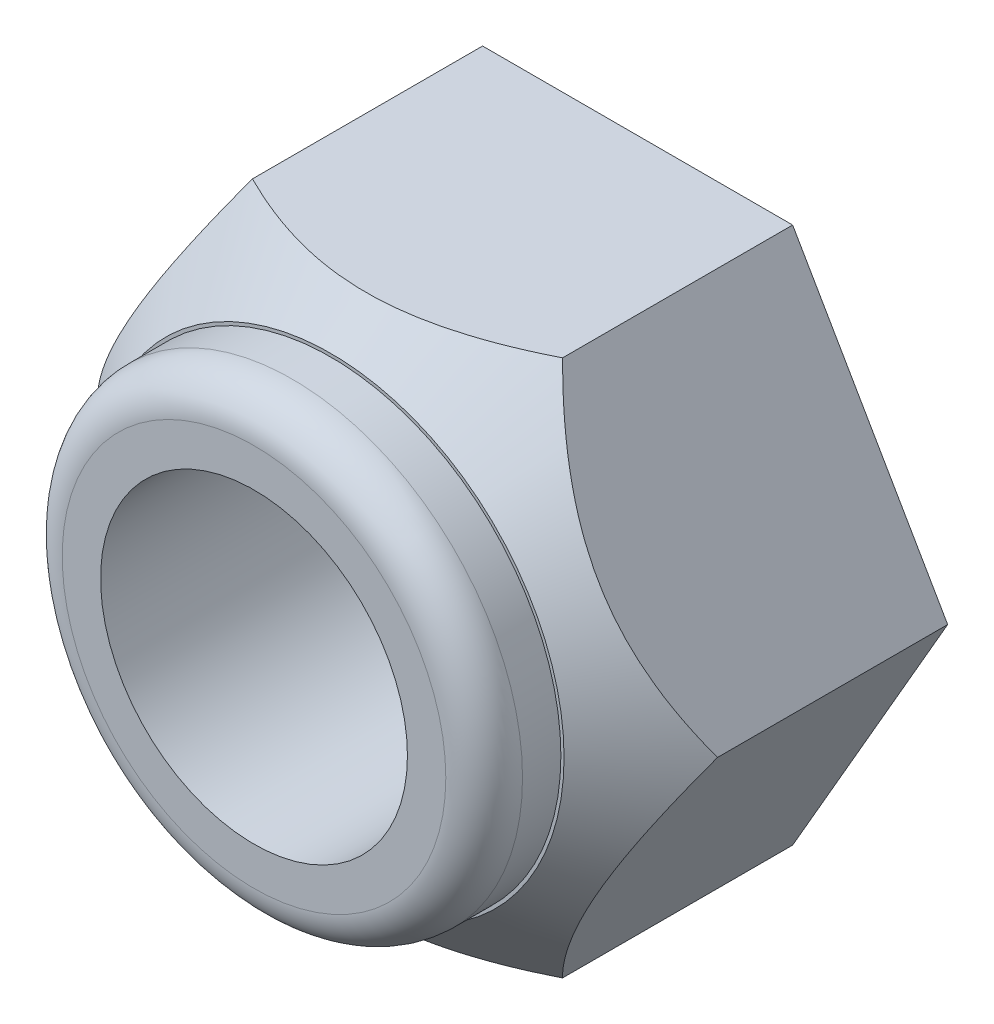
ISO-10303-21;
HEADER;
FILE_DESCRIPTION(('STEP AP214'),'2;1');
FILE_NAME('part.step','',(''),(''),'','','');
FILE_SCHEMA(('AUTOMOTIVE_DESIGN { 1 0 10303 214 1 1 1 1 }'));
ENDSEC;
DATA;
#1=APPLICATION_CONTEXT('core data for automotive mechanical design processes');
#2=APPLICATION_PROTOCOL_DEFINITION('international standard','automotive_design',2000,#1);
#3=PRODUCT_CONTEXT('',#1,'mechanical');
#4=PRODUCT('Part','Part','',(#3));
#5=PRODUCT_RELATED_PRODUCT_CATEGORY('part','',(#4));
#6=PRODUCT_DEFINITION_FORMATION('','',#4);
#7=PRODUCT_DEFINITION_CONTEXT('part definition',#1,'design');
#8=PRODUCT_DEFINITION('design','',#6,#7);
#9=PRODUCT_DEFINITION_SHAPE('','',#8);
#10=(LENGTH_UNIT() NAMED_UNIT(*) SI_UNIT(.MILLI.,.METRE.));
#11=(NAMED_UNIT(*) PLANE_ANGLE_UNIT() SI_UNIT($,.RADIAN.));
#12=(NAMED_UNIT(*) SI_UNIT($,.STERADIAN.) SOLID_ANGLE_UNIT());
#13=UNCERTAINTY_MEASURE_WITH_UNIT(LENGTH_MEASURE(1.E-05),#10,'distance_accuracy_value','');
#14=(GEOMETRIC_REPRESENTATION_CONTEXT(3) GLOBAL_UNCERTAINTY_ASSIGNED_CONTEXT((#13)) GLOBAL_UNIT_ASSIGNED_CONTEXT((#10,
#11,#12)) REPRESENTATION_CONTEXT('',''));
#15=CARTESIAN_POINT('',(0.,0.,0.));
#16=DIRECTION('',(0.,0.,1.));
#17=DIRECTION('',(1.,0.,0.));
#18=AXIS2_PLACEMENT_3D('',#15,#16,#17);
#19=CARTESIAN_POINT('',(2.02072594216369,-3.5,4.));
#20=DIRECTION('',(-0.866025403784439,0.5,0.));
#21=DIRECTION('',(-0.5,-0.866025403784439,0.));
#22=AXIS2_PLACEMENT_3D('',#19,#20,#21);
#23=PLANE('',#22);
#24=CARTESIAN_POINT('',(2.02061047210985,-3.5002,2.99988452499759));
#25=CARTESIAN_POINT('',(2.09007076582137,-3.37989124218299,3.06928406626867));
#26=CARTESIAN_POINT('',(2.16069251433702,-3.25757078563454,3.13460752114447));
#27=CARTESIAN_POINT('',(2.30469791501954,-3.0081461150881,3.25421294831347));
#28=CARTESIAN_POINT('',(2.37809526074122,-2.88101818315745,3.30842837712061));
#29=CARTESIAN_POINT('',(2.52609746963703,-2.62467083771748,3.40130032476617));
#30=CARTESIAN_POINT('',(2.60066464532078,-2.49551670085632,3.44019025979248));
#31=CARTESIAN_POINT('',(2.75144053111007,-2.23436520611305,3.50010809560692));
#32=CARTESIAN_POINT('',(2.82764463582487,-2.10237582500173,3.52118071965238));
#33=CARTESIAN_POINT('',(2.9589800046599,-1.87489629334866,3.54019388535165));
#34=CARTESIAN_POINT('',(3.01394167249194,-1.77969989219485,3.54300830014006));
#35=CARTESIAN_POINT('',(3.1237756002776,-1.58946194887522,3.53826531256006));
#36=CARTESIAN_POINT('',(3.17864782213825,-1.49442047268838,3.53070427424299));
#37=CARTESIAN_POINT('',(3.28787240448755,-1.30523794662391,3.5056421037456));
#38=CARTESIAN_POINT('',(3.34222411425439,-1.21109802382951,3.48812985361989));
#39=CARTESIAN_POINT('',(3.4499940609728,-1.02443500058424,3.44412110260568));
#40=CARTESIAN_POINT('',(3.50341236916322,-0.931911776744044,3.41762529053566));
#41=CARTESIAN_POINT('',(3.59824414642312,-0.767658320357852,3.36311203056567));
#42=CARTESIAN_POINT('',(3.63986754439452,-0.695564480287727,3.33652769615023));
#43=CARTESIAN_POINT('',(3.72236709889695,-0.55267106028771,3.27907462503667));
#44=CARTESIAN_POINT('',(3.76324323262423,-0.481871519855086,3.24820575783653));
#45=CARTESIAN_POINT('',(3.84411947811356,-0.341789753542157,3.18287565935587));
#46=CARTESIAN_POINT('',(3.88412189017021,-0.272503543434726,3.14842572434903));
#47=CARTESIAN_POINT('',(3.96338588982946,-0.135214268813788,3.07638590028467));
#48=CARTESIAN_POINT('',(4.00264791412852,-0.067210447919811,3.03879793793945));
#49=CARTESIAN_POINT('',(4.04156735438122,0.000200000000000176,2.99988452499759));
#50=B_SPLINE_CURVE_WITH_KNOTS('',3,(#24,#25,#26,#27,#28,#29,#30,#31,#32,#33,#34,#35,#36,#37,#38,
#39,#40,#41,#42,#43,#44,#45,#46,#47,#48,#49),.UNSPECIFIED.,.F.,.F.,(4,2,2,2,2,2,2,2,2,2,2,2,4),
(0.,0.466195029511833,0.935106055247665,1.3965703522971,1.85687285909025,2.18628459516076,
2.51581179896771,2.84570789142399,3.17557869467336,3.43762138891188,3.69967206642681,
3.96091985737577,4.22200840855896),.UNSPECIFIED.);
#51=CARTESIAN_POINT('',(2.02072594216369,-3.5,3.));
#52=VERTEX_POINT('',#51);
#53=CARTESIAN_POINT('',(4.04145188432738,0.,3.));
#54=VERTEX_POINT('',#53);
#55=EDGE_CURVE('E92',#52,#54,#50,.T.);
#56=ORIENTED_EDGE('',*,*,#55,.F.);
#57=DIRECTION('',(0.,0.,-1.));
#58=VECTOR('',#57,1.);
#59=CARTESIAN_POINT('',(2.02072594216369,-3.5,4.));
#60=LINE('',#59,#58);
#61=CARTESIAN_POINT('',(2.02072594216369,-3.5,0.));
#62=VERTEX_POINT('',#61);
#63=EDGE_CURVE('E63',#52,#62,#60,.T.);
#64=ORIENTED_EDGE('',*,*,#63,.T.);
#65=DIRECTION('',(0.5,0.866025403784439,0.));
#66=VECTOR('',#65,1.);
#67=CARTESIAN_POINT('',(2.02072594216369,-3.5,0.));
#68=LINE('',#67,#66);
#69=CARTESIAN_POINT('',(4.04145188432738,0.,0.));
#70=VERTEX_POINT('',#69);
#71=EDGE_CURVE('E111',#62,#70,#68,.T.);
#72=ORIENTED_EDGE('',*,*,#71,.T.);
#73=DIRECTION('',(0.,0.,-1.));
#74=VECTOR('',#73,1.);
#75=CARTESIAN_POINT('',(4.04145188432738,0.,4.));
#76=LINE('',#75,#74);
#77=EDGE_CURVE('E105',#54,#70,#76,.T.);
#78=ORIENTED_EDGE('',*,*,#77,.F.);
#79=EDGE_LOOP('',(#56,#64,#72,#78));
#80=FACE_BOUND('',#79,.T.);
#81=ADVANCED_FACE('F40',(#80),#23,.F.);
#82=CARTESIAN_POINT('',(4.04145188432738,0.,4.));
#83=DIRECTION('',(-0.866025403784439,-0.5,0.));
#84=DIRECTION('',(0.5,-0.866025403784439,0.));
#85=AXIS2_PLACEMENT_3D('',#82,#83,#84);
#86=PLANE('',#85);
#87=CARTESIAN_POINT('',(4.04156735438122,-0.000200000000000041,2.99988452499759));
#88=CARTESIAN_POINT('',(3.9721070606697,0.120108757817009,3.06928406626868));
#89=CARTESIAN_POINT('',(3.90148531215405,0.242429214365459,3.13460752114448));
#90=CARTESIAN_POINT('',(3.75747991147153,0.491853884911905,3.25421294831347));
#91=CARTESIAN_POINT('',(3.68408256574985,0.618981816842551,3.30842837712061));
#92=CARTESIAN_POINT('',(3.53608035685404,0.875329162282522,3.40130032476617));
#93=CARTESIAN_POINT('',(3.46151318117029,1.00448329914368,3.44019025979248));
#94=CARTESIAN_POINT('',(3.310737295381,1.26563479388695,3.50010809560692));
#95=CARTESIAN_POINT('',(3.2345331906662,1.39762417499827,3.52118071965238));
#96=CARTESIAN_POINT('',(3.10319782183117,1.62510370665134,3.54019388535165));
#97=CARTESIAN_POINT('',(3.04823615399914,1.72030010780515,3.54300830014006));
#98=CARTESIAN_POINT('',(2.93840222621347,1.91053805112478,3.53826531256006));
#99=CARTESIAN_POINT('',(2.88353000435282,2.00557952731162,3.53070427424299));
#100=CARTESIAN_POINT('',(2.77430542200352,2.19476205337609,3.5056421037456));
#101=CARTESIAN_POINT('',(2.71995371223668,2.28890197617049,3.48812985361989));
#102=CARTESIAN_POINT('',(2.61218376551827,2.47556499941576,3.44412110260568));
#103=CARTESIAN_POINT('',(2.55876545732785,2.56808822325595,3.41762529053566));
#104=CARTESIAN_POINT('',(2.46393368006795,2.73234167964215,3.36311203056568));
#105=CARTESIAN_POINT('',(2.42231028209655,2.80443551971227,3.33652769615023));
#106=CARTESIAN_POINT('',(2.33981072759412,2.94732893971229,3.27907462503667));
#107=CARTESIAN_POINT('',(2.29893459386684,3.01812848014491,3.24820575783653));
#108=CARTESIAN_POINT('',(2.21805834837751,3.15821024645784,3.18287565935587));
#109=CARTESIAN_POINT('',(2.17805593632086,3.22749645656527,3.14842572434903));
#110=CARTESIAN_POINT('',(2.09879193666161,3.36478573118621,3.07638590028466));
#111=CARTESIAN_POINT('',(2.05952991236255,3.43278955208019,3.03879793793945));
#112=CARTESIAN_POINT('',(2.02061047210985,3.5002,2.99988452499759));
#113=B_SPLINE_CURVE_WITH_KNOTS('',3,(#87,#88,#89,#90,#91,#92,#93,#94,#95,#96,#97,#98,#99,#100,
#101,#102,#103,#104,#105,#106,#107,#108,#109,#110,#111,#112),.UNSPECIFIED.,.F.,.F.,(4,2,2,2,2,2,
2,2,2,2,2,2,4),(0.,0.466195029511833,0.935106055247663,1.3965703522971,1.85687285909024,
2.18628459516076,2.5158117989677,2.84570789142399,3.17557869467336,3.43762138891188,
3.69967206642681,3.96091985737577,4.22200840855896),.UNSPECIFIED.);
#114=CARTESIAN_POINT('',(2.02072594216369,3.5,3.));
#115=VERTEX_POINT('',#114);
#116=EDGE_CURVE('E95',#54,#115,#113,.T.);
#117=ORIENTED_EDGE('',*,*,#116,.F.);
#118=ORIENTED_EDGE('',*,*,#77,.T.);
#119=DIRECTION('',(-0.5,0.866025403784439,0.));
#120=VECTOR('',#119,1.);
#121=CARTESIAN_POINT('',(4.04145188432738,0.,0.));
#122=LINE('',#121,#120);
#123=CARTESIAN_POINT('',(2.02072594216369,3.5,0.));
#124=VERTEX_POINT('',#123);
#125=EDGE_CURVE('E226',#70,#124,#122,.T.);
#126=ORIENTED_EDGE('',*,*,#125,.T.);
#127=DIRECTION('',(0.,0.,-1.));
#128=VECTOR('',#127,1.);
#129=CARTESIAN_POINT('',(2.02072594216369,3.5,4.));
#130=LINE('',#129,#128);
#131=EDGE_CURVE('E107',#115,#124,#130,.T.);
#132=ORIENTED_EDGE('',*,*,#131,.F.);
#133=EDGE_LOOP('',(#117,#118,#126,#132));
#134=FACE_BOUND('',#133,.T.);
#135=ADVANCED_FACE('F103',(#134),#86,.F.);
#136=CARTESIAN_POINT('',(2.02072594216369,3.5,4.));
#137=DIRECTION('',(0.,-1.,0.));
#138=DIRECTION('',(0.,0.,-1.));
#139=AXIS2_PLACEMENT_3D('',#136,#137,#138);
#140=PLANE('',#139);
#141=CARTESIAN_POINT('',(6.18425794109595,3.5,-0.0645347665190989));
#142=CARTESIAN_POINT('',(6.00180252654366,3.5,0.0941931425634753));
#143=CARTESIAN_POINT('',(5.81855215929302,3.5,0.252024823630412));
#144=CARTESIAN_POINT('',(5.44984191649664,3.5,0.565257782151259));
#145=CARTESIAN_POINT('',(5.26438105403686,3.5,0.720657896457543));
#146=CARTESIAN_POINT('',(4.88669130230278,3.5,1.03162277509105));
#147=CARTESIAN_POINT('',(4.69440326492645,3.5,1.18711601797476));
#148=CARTESIAN_POINT('',(4.30626561764559,3.5,1.49350550896465));
#149=CARTESIAN_POINT('',(4.11041690570991,3.5,1.64440289111196));
#150=CARTESIAN_POINT('',(3.71371859725802,3.5,1.94006784433849));
#151=CARTESIAN_POINT('',(3.51286314861781,3.5,2.08482765129034));
#152=CARTESIAN_POINT('',(3.20673344587427,3.5,2.29511819124888));
#153=CARTESIAN_POINT('',(3.10383363341975,3.5,2.36410389655238));
#154=CARTESIAN_POINT('',(2.8961903592131,3.5,2.49923980051294));
#155=CARTESIAN_POINT('',(2.79144701856378,3.5,2.56539018445103));
#156=CARTESIAN_POINT('',(2.58058086876806,3.5,2.69375683068548));
#157=CARTESIAN_POINT('',(2.47447304084535,3.5,2.75599759314834));
#158=CARTESIAN_POINT('',(2.25984937299589,3.5,2.8762370471503));
#159=CARTESIAN_POINT('',(2.15133324438093,3.5,2.93423522650266));
#160=CARTESIAN_POINT('',(1.93177906137795,3.5,3.04485425015904));
#161=CARTESIAN_POINT('',(1.82074507140703,3.5,3.0974830982086));
#162=CARTESIAN_POINT('',(1.59579394236442,3.5,3.19614991961919));
#163=CARTESIAN_POINT('',(1.48187759191905,3.5,3.24218967332129));
#164=CARTESIAN_POINT('',(1.24844159989536,3.5,3.32708398721729));
#165=CARTESIAN_POINT('',(1.12885352569492,3.5,3.36575300713368));
#166=CARTESIAN_POINT('',(0.886781548075113,3.5,3.43273007467783));
#167=CARTESIAN_POINT('',(0.764298108293455,3.5,3.46103976934887));
#168=CARTESIAN_POINT('',(0.517922325796097,3.5,3.50539799895646));
#169=CARTESIAN_POINT('',(0.394044638458065,3.5,3.52152630779941));
#170=CARTESIAN_POINT('',(0.145271626545305,3.5,3.54063234159069));
#171=CARTESIAN_POINT('',(0.0203764319135412,3.5,3.54361172017292));
#172=CARTESIAN_POINT('',(-0.229279066918616,3.5,3.53617558395289));
#173=CARTESIAN_POINT('',(-0.354038478113732,3.5,3.52573074786894));
#174=CARTESIAN_POINT('',(-0.601836642194169,3.5,3.49221037144704));
#175=CARTESIAN_POINT('',(-0.724875034563236,3.5,3.46913222416696));
#176=CARTESIAN_POINT('',(-0.969203127736882,3.5,3.41169547122701));
#177=CARTESIAN_POINT('',(-1.09047314040738,3.5,3.37725462257617));
#178=CARTESIAN_POINT('',(-1.32990834418581,3.5,3.29901384215753));
#179=CARTESIAN_POINT('',(-1.44807345535859,3.5,3.25521366970014));
#180=CARTESIAN_POINT('',(-1.7049370843499,3.5,3.15038569141806));
#181=CARTESIAN_POINT('',(-1.84293869501331,3.5,3.08766555178858));
#182=CARTESIAN_POINT('',(-2.1148495863445,3.5,2.95383982666475));
#183=CARTESIAN_POINT('',(-2.24875648222451,3.5,2.88272946751852));
#184=CARTESIAN_POINT('',(-2.51322338205659,3.5,2.73397963092193));
#185=CARTESIAN_POINT('',(-2.64377599615141,3.5,2.6563271221019));
#186=CARTESIAN_POINT('',(-2.90177743652464,3.5,2.49611401182857));
#187=CARTESIAN_POINT('',(-3.02922686295059,3.5,2.41355437020094));
#188=CARTESIAN_POINT('',(-3.28223316692501,3.5,2.2441423743376));
#189=CARTESIAN_POINT('',(-3.40777598214615,3.5,2.15726911597835));
#190=CARTESIAN_POINT('',(-3.65668155685983,3.5,1.98045691058987));
#191=CARTESIAN_POINT('',(-3.78004423912119,3.5,1.8905178552841));
#192=CARTESIAN_POINT('',(-4.14712153109654,3.5,1.61726618893212));
#193=CARTESIAN_POINT('',(-4.38812382939733,3.5,1.43031481916302));
#194=CARTESIAN_POINT('',(-4.89289832862635,3.5,1.02774022303412));
#195=CARTESIAN_POINT('',(-5.15603157796543,3.5,0.811323338605823));
#196=CARTESIAN_POINT('',(-5.54580687189912,3.5,0.483926385732411));
#197=CARTESIAN_POINT('',(-5.674169349427,3.5,0.374981766231863));
#198=CARTESIAN_POINT('',(-5.92990735712964,3.5,0.155999769573668));
#199=CARTESIAN_POINT('',(-6.05728311064127,3.5,0.0459626533708356));
#200=CARTESIAN_POINT('',(-6.18425794109596,3.5,-0.0645347665191007));
#201=B_SPLINE_CURVE_WITH_KNOTS('',3,(#141,#142,#143,#144,#145,#146,#147,#148,#149,#150,#151,
#152,#153,#154,#155,#156,#157,#158,#159,#160,#161,#162,#163,#164,#165,#166,#167,#168,#169,#170,
#171,#172,#173,#174,#175,#176,#177,#178,#179,#180,#181,#182,#183,#184,#185,#186,#187,#188,#189,
#190,#191,#192,#193,#194,#195,#196,#197,#198,#199,#200),.UNSPECIFIED.,.F.,.F.,(4,2,2,2,2,2,2,2,
2,2,2,2,2,2,2,2,2,2,2,2,2,2,2,2,2,2,2,2,2,4),(0.,0.725521243102912,1.45137953906293,
2.19319911099142,2.93483412902759,3.67738092087147,4.04899899439939,4.42059274649379,
4.78956026666891,5.158572257261,5.52702588977471,5.8953797792032,6.27204413855171,
6.64864858547245,7.02276480011038,7.39683396385705,7.77172156280176,8.14668655071227,
8.52442735444327,8.9021778735366,9.35655282797108,9.81118755906022,10.2667503207701,
10.7222242666657,11.1801753204783,11.6381425648103,12.5529930135776,13.5749883379068,
14.0800703937447,14.5850345765213),.UNSPECIFIED.);
#202=CARTESIAN_POINT('',(-2.02072594216369,3.5,3.));
#203=VERTEX_POINT('',#202);
#204=EDGE_CURVE('E108',#115,#203,#201,.T.);
#205=ORIENTED_EDGE('',*,*,#204,.F.);
#206=ORIENTED_EDGE('',*,*,#131,.T.);
#207=DIRECTION('',(-1.,0.,0.));
#208=VECTOR('',#207,1.);
#209=CARTESIAN_POINT('',(2.02072594216369,3.5,0.));
#210=LINE('',#209,#208);
#211=CARTESIAN_POINT('',(-2.02072594216369,3.5,0.));
#212=VERTEX_POINT('',#211);
#213=EDGE_CURVE('E228',#124,#212,#210,.T.);
#214=ORIENTED_EDGE('',*,*,#213,.T.);
#215=DIRECTION('',(0.,0.,-1.));
#216=VECTOR('',#215,1.);
#217=CARTESIAN_POINT('',(-2.02072594216369,3.5,4.));
#218=LINE('',#217,#216);
#219=EDGE_CURVE('E116',#203,#212,#218,.T.);
#220=ORIENTED_EDGE('',*,*,#219,.F.);
#221=EDGE_LOOP('',(#205,#206,#214,#220));
#222=FACE_BOUND('',#221,.T.);
#223=ADVANCED_FACE('F143',(#222),#140,.F.);
#224=CARTESIAN_POINT('',(-2.02072594216369,3.5,4.));
#225=DIRECTION('',(0.866025403784439,-0.5,0.));
#226=DIRECTION('',(0.5,0.866025403784439,0.));
#227=AXIS2_PLACEMENT_3D('',#224,#225,#226);
#228=PLANE('',#227);
#229=CARTESIAN_POINT('',(-2.02061047210985,3.5002,2.99988452499759));
#230=CARTESIAN_POINT('',(-2.09007076582137,3.37989124218299,3.06928406626867));
#231=CARTESIAN_POINT('',(-2.16069251433702,3.25757078563454,3.13460752114447));
#232=CARTESIAN_POINT('',(-2.30469791501954,3.0081461150881,3.25421294831347));
#233=CARTESIAN_POINT('',(-2.37809526074122,2.88101818315745,3.30842837712061));
#234=CARTESIAN_POINT('',(-2.52609746963704,2.62467083771748,3.40130032476617));
#235=CARTESIAN_POINT('',(-2.60066464532078,2.49551670085632,3.44019025979248));
#236=CARTESIAN_POINT('',(-2.75144053111008,2.23436520611306,3.50010809560692));
#237=CARTESIAN_POINT('',(-2.82764463582487,2.10237582500173,3.52118071965238));
#238=CARTESIAN_POINT('',(-2.9589800046599,1.87489629334866,3.54019388535165));
#239=CARTESIAN_POINT('',(-3.01394167249194,1.77969989219485,3.54300830014005));
#240=CARTESIAN_POINT('',(-3.12377560027761,1.58946194887522,3.53826531256005));
#241=CARTESIAN_POINT('',(-3.17864782213826,1.49442047268838,3.53070427424299));
#242=CARTESIAN_POINT('',(-3.28787240448756,1.30523794662391,3.5056421037456));
#243=CARTESIAN_POINT('',(-3.34222411425439,1.21109802382951,3.48812985361989));
#244=CARTESIAN_POINT('',(-3.4499940609728,1.02443500058424,3.44412110260568));
#245=CARTESIAN_POINT('',(-3.50341236916323,0.931911776744044,3.41762529053566));
#246=CARTESIAN_POINT('',(-3.59824414642312,0.767658320357852,3.36311203056567));
#247=CARTESIAN_POINT('',(-3.63986754439452,0.695564480287727,3.33652769615023));
#248=CARTESIAN_POINT('',(-3.72236709889696,0.55267106028771,3.27907462503667));
#249=CARTESIAN_POINT('',(-3.76324323262423,0.481871519855086,3.24820575783653));
#250=CARTESIAN_POINT('',(-3.84411947811356,0.341789753542158,3.18287565935587));
#251=CARTESIAN_POINT('',(-3.88412189017022,0.272503543434726,3.14842572434903));
#252=CARTESIAN_POINT('',(-3.96338588982946,0.135214268813788,3.07638590028466));
#253=CARTESIAN_POINT('',(-4.00264791412852,0.0672104479198113,3.03879793793945));
#254=CARTESIAN_POINT('',(-4.04156735438122,-0.000200000000000049,2.99988452499759));
#255=B_SPLINE_CURVE_WITH_KNOTS('',3,(#229,#230,#231,#232,#233,#234,#235,#236,#237,#238,#239,
#240,#241,#242,#243,#244,#245,#246,#247,#248,#249,#250,#251,#252,#253,#254),.UNSPECIFIED.,.F.,
.F.,(4,2,2,2,2,2,2,2,2,2,2,2,4),(0.,0.466195029511834,0.935106055247666,1.3965703522971,
1.85687285909025,2.18628459516076,2.51581179896771,2.84570789142399,3.17557869467336,
3.43762138891188,3.69967206642681,3.96091985737577,4.22200840855896),.UNSPECIFIED.);
#256=CARTESIAN_POINT('',(-4.04145188432738,0.,3.));
#257=VERTEX_POINT('',#256);
#258=EDGE_CURVE('E180',#203,#257,#255,.T.);
#259=ORIENTED_EDGE('',*,*,#258,.F.);
#260=ORIENTED_EDGE('',*,*,#219,.T.);
#261=DIRECTION('',(-0.5,-0.866025403784439,0.));
#262=VECTOR('',#261,1.);
#263=CARTESIAN_POINT('',(-2.02072594216369,3.5,0.));
#264=LINE('',#263,#262);
#265=CARTESIAN_POINT('',(-4.04145188432738,0.,0.));
#266=VERTEX_POINT('',#265);
#267=EDGE_CURVE('E233',#212,#266,#264,.T.);
#268=ORIENTED_EDGE('',*,*,#267,.T.);
#269=DIRECTION('',(0.,0.,-1.));
#270=VECTOR('',#269,1.);
#271=CARTESIAN_POINT('',(-4.04145188432738,0.,4.));
#272=LINE('',#271,#270);
#273=EDGE_CURVE('E244',#257,#266,#272,.T.);
#274=ORIENTED_EDGE('',*,*,#273,.F.);
#275=EDGE_LOOP('',(#259,#260,#268,#274));
#276=FACE_BOUND('',#275,.T.);
#277=ADVANCED_FACE('F192',(#276),#228,.F.);
#278=CARTESIAN_POINT('',(-4.04145188432738,0.,4.));
#279=DIRECTION('',(0.866025403784439,0.5,0.));
#280=DIRECTION('',(-0.5,0.866025403784439,0.));
#281=AXIS2_PLACEMENT_3D('',#278,#279,#280);
#282=PLANE('',#281);
#283=CARTESIAN_POINT('',(-4.04156735438122,0.000200000000000097,2.99988452499759));
#284=CARTESIAN_POINT('',(-3.9721070606697,-0.120108757817009,3.06928406626867));
#285=CARTESIAN_POINT('',(-3.90148531215405,-0.242429214365458,3.13460752114447));
#286=CARTESIAN_POINT('',(-3.75747991147153,-0.491853884911905,3.25421294831347));
#287=CARTESIAN_POINT('',(-3.68408256574985,-0.618981816842551,3.30842837712061));
#288=CARTESIAN_POINT('',(-3.53608035685404,-0.875329162282523,3.40130032476617));
#289=CARTESIAN_POINT('',(-3.4615131811703,-1.00448329914368,3.44019025979248));
#290=CARTESIAN_POINT('',(-3.310737295381,-1.26563479388695,3.50010809560692));
#291=CARTESIAN_POINT('',(-3.2345331906662,-1.39762417499828,3.52118071965238));
#292=CARTESIAN_POINT('',(-3.10319782183117,-1.62510370665134,3.54019388535165));
#293=CARTESIAN_POINT('',(-3.04823615399914,-1.72030010780515,3.54300830014005));
#294=CARTESIAN_POINT('',(-2.93840222621347,-1.91053805112478,3.53826531256006));
#295=CARTESIAN_POINT('',(-2.88353000435282,-2.00557952731162,3.53070427424299));
#296=CARTESIAN_POINT('',(-2.77430542200352,-2.19476205337609,3.5056421037456));
#297=CARTESIAN_POINT('',(-2.71995371223668,-2.28890197617049,3.48812985361989));
#298=CARTESIAN_POINT('',(-2.61218376551828,-2.47556499941576,3.44412110260568));
#299=CARTESIAN_POINT('',(-2.55876545732785,-2.56808822325596,3.41762529053566));
#300=CARTESIAN_POINT('',(-2.46393368006795,-2.73234167964215,3.36311203056567));
#301=CARTESIAN_POINT('',(-2.42231028209655,-2.80443551971227,3.33652769615023));
#302=CARTESIAN_POINT('',(-2.33981072759412,-2.94732893971229,3.27907462503667));
#303=CARTESIAN_POINT('',(-2.29893459386684,-3.01812848014491,3.24820575783653));
#304=CARTESIAN_POINT('',(-2.21805834837751,-3.15821024645784,3.18287565935587));
#305=CARTESIAN_POINT('',(-2.17805593632086,-3.22749645656527,3.14842572434903));
#306=CARTESIAN_POINT('',(-2.09879193666161,-3.36478573118621,3.07638590028466));
#307=CARTESIAN_POINT('',(-2.05952991236255,-3.43278955208019,3.03879793793945));
#308=CARTESIAN_POINT('',(-2.02061047210985,-3.5002,2.99988452499759));
#309=B_SPLINE_CURVE_WITH_KNOTS('',3,(#283,#284,#285,#286,#287,#288,#289,#290,#291,#292,#293,
#294,#295,#296,#297,#298,#299,#300,#301,#302,#303,#304,#305,#306,#307,#308),.UNSPECIFIED.,.F.,
.F.,(4,2,2,2,2,2,2,2,2,2,2,2,4),(0.,0.466195029511833,0.935106055247664,1.3965703522971,
1.85687285909024,2.18628459516076,2.51581179896771,2.84570789142399,3.17557869467336,
3.43762138891188,3.69967206642681,3.96091985737577,4.22200840855896),.UNSPECIFIED.);
#310=CARTESIAN_POINT('',(-2.02072594216369,-3.5,3.));
#311=VERTEX_POINT('',#310);
#312=EDGE_CURVE('E55',#257,#311,#309,.T.);
#313=ORIENTED_EDGE('',*,*,#312,.F.);
#314=ORIENTED_EDGE('',*,*,#273,.T.);
#315=DIRECTION('',(0.5,-0.866025403784439,0.));
#316=VECTOR('',#315,1.);
#317=CARTESIAN_POINT('',(-4.04145188432738,0.,0.));
#318=LINE('',#317,#316);
#319=CARTESIAN_POINT('',(-2.02072594216369,-3.5,0.));
#320=VERTEX_POINT('',#319);
#321=EDGE_CURVE('E236',#266,#320,#318,.T.);
#322=ORIENTED_EDGE('',*,*,#321,.T.);
#323=DIRECTION('',(0.,0.,-1.));
#324=VECTOR('',#323,1.);
#325=CARTESIAN_POINT('',(-2.02072594216369,-3.5,4.));
#326=LINE('',#325,#324);
#327=EDGE_CURVE('E242',#311,#320,#326,.T.);
#328=ORIENTED_EDGE('',*,*,#327,.F.);
#329=EDGE_LOOP('',(#313,#314,#322,#328));
#330=FACE_BOUND('',#329,.T.);
#331=ADVANCED_FACE('F196',(#330),#282,.F.);
#332=CARTESIAN_POINT('',(-2.02072594216369,-3.5,4.));
#333=DIRECTION('',(0.,1.,0.));
#334=DIRECTION('',(0.,0.,1.));
#335=AXIS2_PLACEMENT_3D('',#332,#333,#334);
#336=PLANE('',#335);
#337=CARTESIAN_POINT('',(-6.18425794109596,-3.5,-0.0645347665191023));
#338=CARTESIAN_POINT('',(-6.00180252654367,-3.5,0.0941931425634724));
#339=CARTESIAN_POINT('',(-5.81855215929303,-3.5,0.252024823630409));
#340=CARTESIAN_POINT('',(-5.44984191649665,-3.5,0.565257782151257));
#341=CARTESIAN_POINT('',(-5.26438105403687,-3.5,0.720657896457541));
#342=CARTESIAN_POINT('',(-4.88669130230279,-3.5,1.03162277509105));
#343=CARTESIAN_POINT('',(-4.69440326492645,-3.5,1.18711601797476));
#344=CARTESIAN_POINT('',(-4.3062656176456,-3.5,1.49350550896464));
#345=CARTESIAN_POINT('',(-4.11041690570991,-3.5,1.64440289111196));
#346=CARTESIAN_POINT('',(-3.71371859725802,-3.5,1.94006784433848));
#347=CARTESIAN_POINT('',(-3.51286314861782,-3.5,2.08482765129034));
#348=CARTESIAN_POINT('',(-3.20673344587427,-3.5,2.29511819124888));
#349=CARTESIAN_POINT('',(-3.10383363341975,-3.5,2.36410389655238));
#350=CARTESIAN_POINT('',(-2.89619035921311,-3.5,2.49923980051294));
#351=CARTESIAN_POINT('',(-2.79144701856378,-3.5,2.56539018445103));
#352=CARTESIAN_POINT('',(-2.58058086876806,-3.5,2.69375683068548));
#353=CARTESIAN_POINT('',(-2.47447304084536,-3.5,2.75599759314834));
#354=CARTESIAN_POINT('',(-2.2598493729959,-3.5,2.8762370471503));
#355=CARTESIAN_POINT('',(-2.15133324438093,-3.5,2.93423522650266));
#356=CARTESIAN_POINT('',(-1.93177906137795,-3.5,3.04485425015903));
#357=CARTESIAN_POINT('',(-1.82074507140704,-3.5,3.0974830982086));
#358=CARTESIAN_POINT('',(-1.59579394236442,-3.5,3.19614991961919));
#359=CARTESIAN_POINT('',(-1.48187759191905,-3.5,3.24218967332129));
#360=CARTESIAN_POINT('',(-1.24844159989536,-3.5,3.32708398721729));
#361=CARTESIAN_POINT('',(-1.12885352569492,-3.5,3.36575300713368));
#362=CARTESIAN_POINT('',(-0.886781548075116,-3.5,3.43273007467783));
#363=CARTESIAN_POINT('',(-0.764298108293458,-3.5,3.46103976934887));
#364=CARTESIAN_POINT('',(-0.5179223257961,-3.5,3.50539799895646));
#365=CARTESIAN_POINT('',(-0.394044638458068,-3.5,3.52152630779941));
#366=CARTESIAN_POINT('',(-0.145271626545308,-3.5,3.5406323415907));
#367=CARTESIAN_POINT('',(-0.0203764319135438,-3.5,3.54361172017293));
#368=CARTESIAN_POINT('',(0.229279066918614,-3.5,3.53617558395289));
#369=CARTESIAN_POINT('',(0.35403847811373,-3.5,3.52573074786894));
#370=CARTESIAN_POINT('',(0.601836642194168,-3.5,3.49221037144704));
#371=CARTESIAN_POINT('',(0.724875034563235,-3.5,3.46913222416696));
#372=CARTESIAN_POINT('',(0.969203127736882,-3.5,3.41169547122701));
#373=CARTESIAN_POINT('',(1.09047314040738,-3.5,3.37725462257617));
#374=CARTESIAN_POINT('',(1.32990834418581,-3.5,3.29901384215753));
#375=CARTESIAN_POINT('',(1.44807345535858,-3.5,3.25521366970014));
#376=CARTESIAN_POINT('',(1.70493708434989,-3.5,3.15038569141806));
#377=CARTESIAN_POINT('',(1.84293869501331,-3.5,3.08766555178858));
#378=CARTESIAN_POINT('',(2.1148495863445,-3.5,2.95383982666476));
#379=CARTESIAN_POINT('',(2.24875648222451,-3.5,2.88272946751852));
#380=CARTESIAN_POINT('',(2.51322338205659,-3.5,2.73397963092193));
#381=CARTESIAN_POINT('',(2.64377599615141,-3.5,2.6563271221019));
#382=CARTESIAN_POINT('',(2.90177743652464,-3.5,2.49611401182857));
#383=CARTESIAN_POINT('',(3.02922686295059,-3.5,2.41355437020094));
#384=CARTESIAN_POINT('',(3.28223316692501,-3.5,2.24414237433761));
#385=CARTESIAN_POINT('',(3.40777598214615,-3.5,2.15726911597835));
#386=CARTESIAN_POINT('',(3.65668155685983,-3.5,1.98045691058988));
#387=CARTESIAN_POINT('',(3.78004423912118,-3.5,1.8905178552841));
#388=CARTESIAN_POINT('',(4.14712153109654,-3.5,1.61726618893212));
#389=CARTESIAN_POINT('',(4.38812382939733,-3.5,1.43031481916302));
#390=CARTESIAN_POINT('',(4.89289832862635,-3.5,1.02774022303413));
#391=CARTESIAN_POINT('',(5.15603157796542,-3.5,0.811323338605826));
#392=CARTESIAN_POINT('',(5.54580687189911,-3.5,0.483926385732414));
#393=CARTESIAN_POINT('',(5.674169349427,-3.5,0.374981766231867));
#394=CARTESIAN_POINT('',(5.92990735712964,-3.5,0.155999769573671));
#395=CARTESIAN_POINT('',(6.05728311064127,-3.5,0.0459626533708383));
#396=CARTESIAN_POINT('',(6.18425794109595,-3.5,-0.064534766519099));
#397=B_SPLINE_CURVE_WITH_KNOTS('',3,(#337,#338,#339,#340,#341,#342,#343,#344,#345,#346,#347,
#348,#349,#350,#351,#352,#353,#354,#355,#356,#357,#358,#359,#360,#361,#362,#363,#364,#365,#366,
#367,#368,#369,#370,#371,#372,#373,#374,#375,#376,#377,#378,#379,#380,#381,#382,#383,#384,#385,
#386,#387,#388,#389,#390,#391,#392,#393,#394,#395,#396),.UNSPECIFIED.,.F.,.F.,(4,2,2,2,2,2,2,2,
2,2,2,2,2,2,2,2,2,2,2,2,2,2,2,2,2,2,2,2,2,4),(0.,0.725521243102912,1.45137953906293,
2.19319911099142,2.93483412902759,3.67738092087147,4.04899899439939,4.42059274649379,
4.78956026666891,5.158572257261,5.52702588977471,5.89537977920321,6.27204413855171,
6.64864858547245,7.02276480011039,7.39683396385705,7.77172156280176,8.14668655071228,
8.52442735444328,8.90217787353661,9.35655282797109,9.81118755906022,10.2667503207701,
10.7222242666657,11.1801753204783,11.6381425648103,12.5529930135776,13.5749883379068,
14.0800703937448,14.5850345765213),.UNSPECIFIED.);
#398=EDGE_CURVE('E97',#311,#52,#397,.T.);
#399=ORIENTED_EDGE('',*,*,#398,.F.);
#400=ORIENTED_EDGE('',*,*,#327,.T.);
#401=DIRECTION('',(1.,0.,0.));
#402=VECTOR('',#401,1.);
#403=CARTESIAN_POINT('',(-2.02072594216369,-3.5,0.));
#404=LINE('',#403,#402);
#405=EDGE_CURVE('E239',#320,#62,#404,.T.);
#406=ORIENTED_EDGE('',*,*,#405,.T.);
#407=ORIENTED_EDGE('',*,*,#63,.F.);
#408=EDGE_LOOP('',(#399,#400,#406,#407));
#409=FACE_BOUND('',#408,.T.);
#410=ADVANCED_FACE('F200',(#409),#336,.F.);
#411=CARTESIAN_POINT('',(0.,0.,4.));
#412=DIRECTION('',(0.,0.,1.));
#413=DIRECTION('',(1.,0.,0.));
#414=AXIS2_PLACEMENT_3D('',#411,#412,#413);
#415=PLANE('',#414);
#416=CARTESIAN_POINT('',(0.,0.,4.));
#417=DIRECTION('',(0.,0.,1.));
#418=DIRECTION('',(1.,0.,0.));
#419=AXIS2_PLACEMENT_3D('',#416,#417,#418);
#420=CIRCLE('',#419,3.);
#421=CARTESIAN_POINT('',(3.,0.,4.));
#422=VERTEX_POINT('',#421);
#423=EDGE_CURVE('E112',#422,#422,#420,.T.);
#424=ORIENTED_EDGE('',*,*,#423,.F.);
#425=EDGE_LOOP('',(#424));
#426=FACE_BOUND('',#425,.T.);
#427=CARTESIAN_POINT('',(0.,0.,4.));
#428=DIRECTION('',(0.,0.,1.));
#429=DIRECTION('',(1.,0.,0.));
#430=AXIS2_PLACEMENT_3D('',#427,#428,#429);
#431=CIRCLE('',#430,3.04145188432738);
#432=CARTESIAN_POINT('',(3.04145188432738,0.,4.));
#433=VERTEX_POINT('',#432);
#434=EDGE_CURVE('E254',#433,#433,#431,.T.);
#435=ORIENTED_EDGE('',*,*,#434,.T.);
#436=EDGE_LOOP('',(#435));
#437=FACE_BOUND('',#436,.T.);
#438=ADVANCED_FACE('F205',(#426,#437),#415,.T.);
#439=CARTESIAN_POINT('',(0.,0.,0.));
#440=DIRECTION('',(0.,0.,1.));
#441=DIRECTION('',(1.,0.,0.));
#442=AXIS2_PLACEMENT_3D('',#439,#440,#441);
#443=PLANE('',#442);
#444=CARTESIAN_POINT('',(0.,0.,0.));
#445=DIRECTION('',(0.,0.,1.));
#446=DIRECTION('',(1.,0.,0.));
#447=AXIS2_PLACEMENT_3D('',#444,#445,#446);
#448=CIRCLE('',#447,2.);
#449=CARTESIAN_POINT('',(2.,0.,0.));
#450=VERTEX_POINT('',#449);
#451=EDGE_CURVE('E121',#450,#450,#448,.T.);
#452=ORIENTED_EDGE('',*,*,#451,.T.);
#453=EDGE_LOOP('',(#452));
#454=FACE_BOUND('',#453,.T.);
#455=ORIENTED_EDGE('',*,*,#71,.F.);
#456=ORIENTED_EDGE('',*,*,#405,.F.);
#457=ORIENTED_EDGE('',*,*,#321,.F.);
#458=ORIENTED_EDGE('',*,*,#267,.F.);
#459=ORIENTED_EDGE('',*,*,#213,.F.);
#460=ORIENTED_EDGE('',*,*,#125,.F.);
#461=EDGE_LOOP('',(#455,#456,#457,#458,#459,#460));
#462=FACE_BOUND('',#461,.T.);
#463=ADVANCED_FACE('F207',(#454,#462),#443,.F.);
#464=CARTESIAN_POINT('',(0.,0.,5.));
#465=DIRECTION('',(0.,0.,-1.));
#466=DIRECTION('',(-1.,0.,0.));
#467=AXIS2_PLACEMENT_3D('',#464,#465,#466);
#468=CYLINDRICAL_SURFACE('',#467,3.);
#469=CARTESIAN_POINT('',(0.,0.,4.5));
#470=DIRECTION('',(0.,0.,1.));
#471=DIRECTION('',(1.,0.,0.));
#472=AXIS2_PLACEMENT_3D('',#469,#470,#471);
#473=CIRCLE('',#472,3.);
#474=CARTESIAN_POINT('',(3.,0.,4.5));
#475=VERTEX_POINT('',#474);
#476=EDGE_CURVE('E11',#475,#475,#473,.F.);
#477=ORIENTED_EDGE('',*,*,#476,.T.);
#478=EDGE_LOOP('',(#477));
#479=FACE_BOUND('',#478,.T.);
#480=ORIENTED_EDGE('',*,*,#423,.T.);
#481=EDGE_LOOP('',(#480));
#482=FACE_BOUND('',#481,.T.);
#483=ADVANCED_FACE('F210',(#479,#482),#468,.T.);
#484=CARTESIAN_POINT('',(0.,0.,5.));
#485=DIRECTION('',(0.,0.,1.));
#486=DIRECTION('',(1.,0.,0.));
#487=AXIS2_PLACEMENT_3D('',#484,#485,#486);
#488=PLANE('',#487);
#489=CARTESIAN_POINT('',(0.,0.,5.));
#490=DIRECTION('',(0.,0.,1.));
#491=DIRECTION('',(1.,0.,0.));
#492=AXIS2_PLACEMENT_3D('',#489,#490,#491);
#493=CIRCLE('',#492,2.5);
#494=CARTESIAN_POINT('',(2.5,0.,5.));
#495=VERTEX_POINT('',#494);
#496=EDGE_CURVE('E48',#495,#495,#493,.T.);
#497=ORIENTED_EDGE('',*,*,#496,.T.);
#498=EDGE_LOOP('',(#497));
#499=FACE_BOUND('',#498,.T.);
#500=CARTESIAN_POINT('',(0.,0.,5.));
#501=DIRECTION('',(0.,0.,1.));
#502=DIRECTION('',(1.,0.,0.));
#503=AXIS2_PLACEMENT_3D('',#500,#501,#502);
#504=CIRCLE('',#503,2.);
#505=CARTESIAN_POINT('',(2.,0.,5.));
#506=VERTEX_POINT('',#505);
#507=EDGE_CURVE('E99',#506,#506,#504,.T.);
#508=ORIENTED_EDGE('',*,*,#507,.F.);
#509=EDGE_LOOP('',(#508));
#510=FACE_BOUND('',#509,.T.);
#511=ADVANCED_FACE('F125',(#499,#510),#488,.T.);
#512=CARTESIAN_POINT('',(0.,0.,-1.5));
#513=DIRECTION('',(0.,0.,1.));
#514=DIRECTION('',(1.,0.,0.));
#515=AXIS2_PLACEMENT_3D('',#512,#513,#514);
#516=CYLINDRICAL_SURFACE('',#515,2.);
#517=ORIENTED_EDGE('',*,*,#507,.T.);
#518=EDGE_LOOP('',(#517));
#519=FACE_BOUND('',#518,.T.);
#520=ORIENTED_EDGE('',*,*,#451,.F.);
#521=EDGE_LOOP('',(#520));
#522=FACE_BOUND('',#521,.T.);
#523=ADVANCED_FACE('F134',(#519,#522),#516,.F.);
#524=CARTESIAN_POINT('',(0.,0.,4.));
#525=DIRECTION('',(0.,0.,-1.));
#526=DIRECTION('',(-1.,0.,0.));
#527=AXIS2_PLACEMENT_3D('',#524,#525,#526);
#528=CONICAL_SURFACE('',#527,3.04145188432738,0.785398163397448);
#529=ORIENTED_EDGE('',*,*,#434,.F.);
#530=EDGE_LOOP('',(#529));
#531=FACE_BOUND('',#530,.T.);
#532=ORIENTED_EDGE('',*,*,#55,.T.);
#533=ORIENTED_EDGE('',*,*,#116,.T.);
#534=ORIENTED_EDGE('',*,*,#204,.T.);
#535=ORIENTED_EDGE('',*,*,#258,.T.);
#536=ORIENTED_EDGE('',*,*,#312,.T.);
#537=ORIENTED_EDGE('',*,*,#398,.T.);
#538=EDGE_LOOP('',(#532,#533,#534,#535,#536,#537));
#539=FACE_BOUND('',#538,.T.);
#540=ADVANCED_FACE('F94',(#531,#539),#528,.T.);
#541=CARTESIAN_POINT('',(0.,0.,4.5));
#542=DIRECTION('',(0.,0.,1.));
#543=DIRECTION('',(1.,0.,0.));
#544=AXIS2_PLACEMENT_3D('',#541,#542,#543);
#545=TOROIDAL_SURFACE('',#544,2.5,0.5);
#546=ORIENTED_EDGE('',*,*,#476,.F.);
#547=EDGE_LOOP('',(#546));
#548=FACE_BOUND('',#547,.T.);
#549=ORIENTED_EDGE('',*,*,#496,.F.);
#550=EDGE_LOOP('',(#549));
#551=FACE_BOUND('',#550,.T.);
#552=ADVANCED_FACE('F42',(#548,#551),#545,.T.);
#553=CLOSED_SHELL('',(#81,#135,#223,#277,#331,#410,#438,#463,#483,#511,#523,#540,#552));
#554=MANIFOLD_SOLID_BREP('B2',#553);
#555=ADVANCED_BREP_SHAPE_REPRESENTATION('',(#18,#554),#14);
#556=SHAPE_DEFINITION_REPRESENTATION(#9,#555);
ENDSEC;
END-ISO-10303-21;
